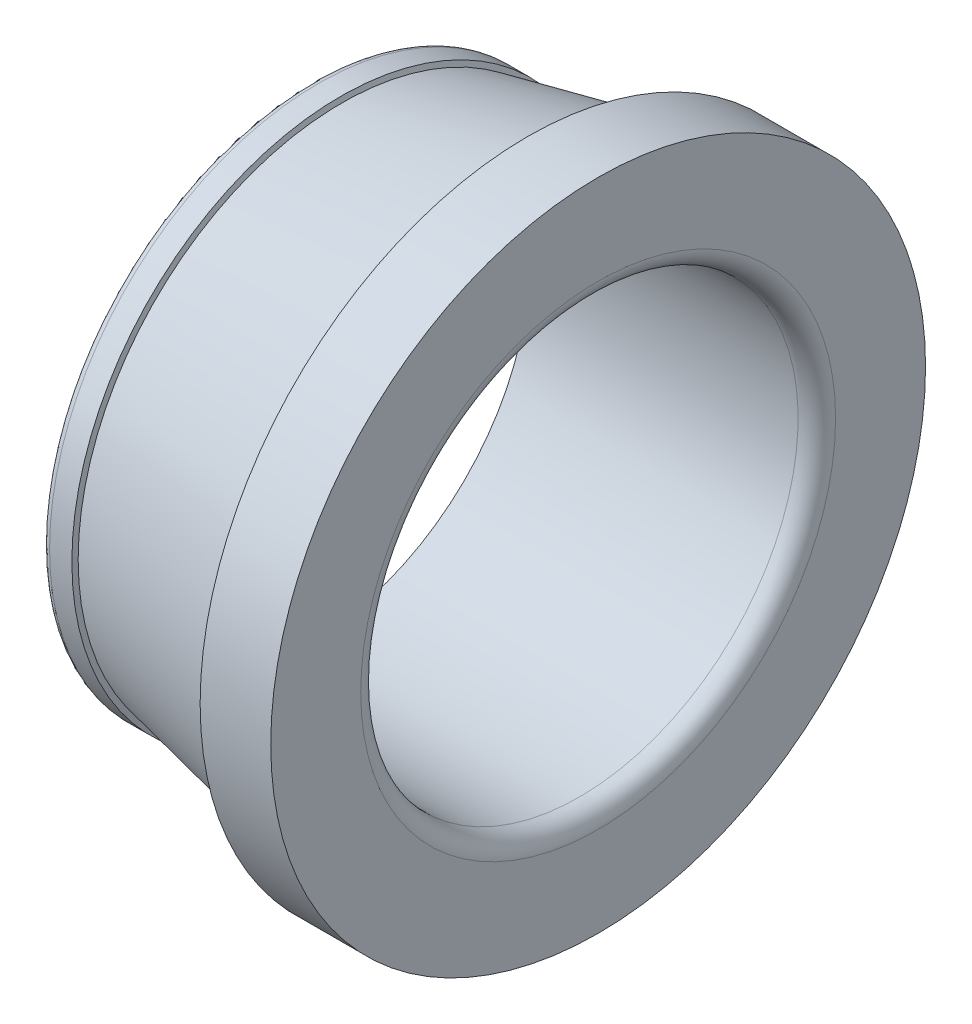
ISO-10303-21;
HEADER;
FILE_DESCRIPTION(('STEP AP214'),'2;1');
FILE_NAME('part.step','',(''),(''),'','','');
FILE_SCHEMA(('AUTOMOTIVE_DESIGN { 1 0 10303 214 1 1 1 1 }'));
ENDSEC;
DATA;
#1=APPLICATION_CONTEXT('core data for automotive mechanical design processes');
#2=APPLICATION_PROTOCOL_DEFINITION('international standard','automotive_design',2000,#1);
#3=PRODUCT_CONTEXT('',#1,'mechanical');
#4=PRODUCT('Part','Part','',(#3));
#5=PRODUCT_RELATED_PRODUCT_CATEGORY('part','',(#4));
#6=PRODUCT_DEFINITION_FORMATION('','',#4);
#7=PRODUCT_DEFINITION_CONTEXT('part definition',#1,'design');
#8=PRODUCT_DEFINITION('design','',#6,#7);
#9=PRODUCT_DEFINITION_SHAPE('','',#8);
#10=(LENGTH_UNIT() NAMED_UNIT(*) SI_UNIT(.MILLI.,.METRE.));
#11=(NAMED_UNIT(*) PLANE_ANGLE_UNIT() SI_UNIT($,.RADIAN.));
#12=(NAMED_UNIT(*) SI_UNIT($,.STERADIAN.) SOLID_ANGLE_UNIT());
#13=UNCERTAINTY_MEASURE_WITH_UNIT(LENGTH_MEASURE(1.E-05),#10,'distance_accuracy_value','');
#14=(GEOMETRIC_REPRESENTATION_CONTEXT(3) GLOBAL_UNCERTAINTY_ASSIGNED_CONTEXT((#13)) GLOBAL_UNIT_ASSIGNED_CONTEXT((#10,
#11,#12)) REPRESENTATION_CONTEXT('',''));
#15=CARTESIAN_POINT('',(0.,0.,0.));
#16=DIRECTION('',(0.,0.,1.));
#17=DIRECTION('',(1.,0.,0.));
#18=AXIS2_PLACEMENT_3D('',#15,#16,#17);
#19=CARTESIAN_POINT('',(1.25,20.9,0.));
#20=DIRECTION('',(1.,0.,0.));
#21=DIRECTION('',(0.,0.,-1.));
#22=AXIS2_PLACEMENT_3D('',#19,#20,#21);
#23=PLANE('',#22);
#24=CARTESIAN_POINT('',(1.25,0.,0.));
#25=DIRECTION('',(-1.,0.,0.));
#26=DIRECTION('',(0.,0.,1.));
#27=AXIS2_PLACEMENT_3D('',#24,#25,#26);
#28=CIRCLE('',#27,17.5);
#29=CARTESIAN_POINT('',(1.25,0.,17.5));
#30=VERTEX_POINT('',#29);
#31=EDGE_CURVE('E10',#30,#30,#28,.T.);
#32=ORIENTED_EDGE('',*,*,#31,.F.);
#33=EDGE_LOOP('',(#32));
#34=FACE_BOUND('',#33,.T.);
#35=CARTESIAN_POINT('',(1.25,0.,0.));
#36=DIRECTION('',(-1.,0.,0.));
#37=DIRECTION('',(0.,0.,1.));
#38=AXIS2_PLACEMENT_3D('',#35,#36,#37);
#39=CIRCLE('',#38,20.9);
#40=CARTESIAN_POINT('',(1.25,0.,20.9));
#41=VERTEX_POINT('',#40);
#42=EDGE_CURVE('E49',#41,#41,#39,.T.);
#43=ORIENTED_EDGE('',*,*,#42,.T.);
#44=EDGE_LOOP('',(#43));
#45=FACE_BOUND('',#44,.T.);
#46=ADVANCED_FACE('F15',(#34,#45),#23,.F.);
#47=CARTESIAN_POINT('',(0.,0.,0.));
#48=DIRECTION('',(-1.,0.,0.));
#49=DIRECTION('',(0.,0.,1.));
#50=AXIS2_PLACEMENT_3D('',#47,#48,#49);
#51=CYLINDRICAL_SURFACE('',#50,17.5);
#52=CARTESIAN_POINT('',(22.75,0.,0.));
#53=DIRECTION('',(-1.,0.,0.));
#54=DIRECTION('',(0.,0.,1.));
#55=AXIS2_PLACEMENT_3D('',#52,#53,#54);
#56=CIRCLE('',#55,17.5);
#57=CARTESIAN_POINT('',(22.75,0.,17.5));
#58=VERTEX_POINT('',#57);
#59=EDGE_CURVE('E21',#58,#58,#56,.T.);
#60=ORIENTED_EDGE('',*,*,#59,.F.);
#61=EDGE_LOOP('',(#60));
#62=FACE_BOUND('',#61,.T.);
#63=ORIENTED_EDGE('',*,*,#31,.T.);
#64=EDGE_LOOP('',(#63));
#65=FACE_BOUND('',#64,.T.);
#66=ADVANCED_FACE('F73',(#62,#65),#51,.F.);
#67=CARTESIAN_POINT('',(22.75,0.,0.));
#68=DIRECTION('',(-1.,0.,0.));
#69=DIRECTION('',(0.,0.,1.));
#70=AXIS2_PLACEMENT_3D('',#67,#68,#69);
#71=TOROIDAL_SURFACE('',#70,19.,1.5);
#72=CARTESIAN_POINT('',(24.25,0.,0.));
#73=DIRECTION('',(-1.,0.,0.));
#74=DIRECTION('',(0.,0.,1.));
#75=AXIS2_PLACEMENT_3D('',#72,#73,#74);
#76=CIRCLE('',#75,19.);
#77=CARTESIAN_POINT('',(24.25,0.,19.));
#78=VERTEX_POINT('',#77);
#79=EDGE_CURVE('E25',#78,#78,#76,.T.);
#80=ORIENTED_EDGE('',*,*,#79,.F.);
#81=EDGE_LOOP('',(#80));
#82=FACE_BOUND('',#81,.T.);
#83=ORIENTED_EDGE('',*,*,#59,.T.);
#84=EDGE_LOOP('',(#83));
#85=FACE_BOUND('',#84,.T.);
#86=ADVANCED_FACE('F78',(#82,#85),#71,.T.);
#87=CARTESIAN_POINT('',(24.25,19.,0.));
#88=DIRECTION('',(-1.,0.,0.));
#89=DIRECTION('',(0.,0.,1.));
#90=AXIS2_PLACEMENT_3D('',#87,#88,#89);
#91=PLANE('',#90);
#92=CARTESIAN_POINT('',(24.25,0.,0.));
#93=DIRECTION('',(-1.,0.,0.));
#94=DIRECTION('',(0.,0.,1.));
#95=AXIS2_PLACEMENT_3D('',#92,#93,#94);
#96=CIRCLE('',#95,26.2);
#97=CARTESIAN_POINT('',(24.25,0.,26.2));
#98=VERTEX_POINT('',#97);
#99=EDGE_CURVE('E29',#98,#98,#96,.T.);
#100=ORIENTED_EDGE('',*,*,#99,.F.);
#101=EDGE_LOOP('',(#100));
#102=FACE_BOUND('',#101,.T.);
#103=ORIENTED_EDGE('',*,*,#79,.T.);
#104=EDGE_LOOP('',(#103));
#105=FACE_BOUND('',#104,.T.);
#106=ADVANCED_FACE('F83',(#102,#105),#91,.F.);
#107=CARTESIAN_POINT('',(0.,0.,0.));
#108=DIRECTION('',(-1.,0.,0.));
#109=DIRECTION('',(0.,0.,1.));
#110=AXIS2_PLACEMENT_3D('',#107,#108,#109);
#111=CYLINDRICAL_SURFACE('',#110,26.2);
#112=CARTESIAN_POINT('',(18.5997511111111,0.,0.));
#113=DIRECTION('',(-1.,0.,0.));
#114=DIRECTION('',(0.,0.,1.));
#115=AXIS2_PLACEMENT_3D('',#112,#113,#114);
#116=CIRCLE('',#115,26.2);
#117=CARTESIAN_POINT('',(18.5997511111111,0.,26.2));
#118=VERTEX_POINT('',#117);
#119=EDGE_CURVE('E34',#118,#118,#116,.T.);
#120=ORIENTED_EDGE('',*,*,#119,.F.);
#121=EDGE_LOOP('',(#120));
#122=FACE_BOUND('',#121,.T.);
#123=ORIENTED_EDGE('',*,*,#99,.T.);
#124=EDGE_LOOP('',(#123));
#125=FACE_BOUND('',#124,.T.);
#126=ADVANCED_FACE('F89',(#122,#125),#111,.T.);
#127=CARTESIAN_POINT('',(18.5997511111111,0.,0.));
#128=DIRECTION('',(-1.,0.,0.));
#129=DIRECTION('',(0.,0.,1.));
#130=AXIS2_PLACEMENT_3D('',#127,#128,#129);
#131=CONICAL_SURFACE('',#130,26.2,1.3289573707766);
#132=CARTESIAN_POINT('',(19.0649954792768,0.,0.));
#133=DIRECTION('',(-1.,0.,0.));
#134=DIRECTION('',(0.,0.,1.));
#135=AXIS2_PLACEMENT_3D('',#132,#133,#134);
#136=CIRCLE('',#135,24.3138741831118);
#137=CARTESIAN_POINT('',(19.0649954792768,0.,24.3138741831118));
#138=VERTEX_POINT('',#137);
#139=EDGE_CURVE('E37',#138,#138,#136,.T.);
#140=ORIENTED_EDGE('',*,*,#139,.F.);
#141=EDGE_LOOP('',(#140));
#142=FACE_BOUND('',#141,.T.);
#143=ORIENTED_EDGE('',*,*,#119,.T.);
#144=EDGE_LOOP('',(#143));
#145=FACE_BOUND('',#144,.T.);
#146=ADVANCED_FACE('F93',(#142,#145),#131,.F.);
#147=CARTESIAN_POINT('',(19.0649954792768,0.,0.));
#148=DIRECTION('',(1.,0.,0.));
#149=DIRECTION('',(0.,0.,-1.));
#150=AXIS2_PLACEMENT_3D('',#147,#148,#149);
#151=CONICAL_SURFACE('',#150,24.3138741831118,0.206932370978414);
#152=CARTESIAN_POINT('',(3.73406587419581,0.,0.));
#153=DIRECTION('',(-1.,0.,0.));
#154=DIRECTION('',(0.,0.,1.));
#155=AXIS2_PLACEMENT_3D('',#152,#153,#154);
#156=CIRCLE('',#155,21.095336546053);
#157=CARTESIAN_POINT('',(3.73406587419581,0.,21.095336546053));
#158=VERTEX_POINT('',#157);
#159=EDGE_CURVE('E40',#158,#158,#156,.T.);
#160=ORIENTED_EDGE('',*,*,#159,.F.);
#161=EDGE_LOOP('',(#160));
#162=FACE_BOUND('',#161,.T.);
#163=ORIENTED_EDGE('',*,*,#139,.T.);
#164=EDGE_LOOP('',(#163));
#165=FACE_BOUND('',#164,.T.);
#166=ADVANCED_FACE('F69',(#162,#165),#151,.T.);
#167=CARTESIAN_POINT('',(3.73406587419581,0.,0.));
#168=DIRECTION('',(-1.,0.,0.));
#169=DIRECTION('',(0.,0.,1.));
#170=AXIS2_PLACEMENT_3D('',#167,#168,#169);
#171=CONICAL_SURFACE('',#170,21.095336546053,1.32895737077659);
#172=CARTESIAN_POINT('',(3.63424888888889,0.,0.));
#173=DIRECTION('',(-1.,0.,0.));
#174=DIRECTION('',(0.,0.,1.));
#175=AXIS2_PLACEMENT_3D('',#172,#173,#174);
#176=CIRCLE('',#175,21.5);
#177=CARTESIAN_POINT('',(3.63424888888889,0.,21.5));
#178=VERTEX_POINT('',#177);
#179=EDGE_CURVE('E43',#178,#178,#176,.T.);
#180=ORIENTED_EDGE('',*,*,#179,.F.);
#181=EDGE_LOOP('',(#180));
#182=FACE_BOUND('',#181,.T.);
#183=ORIENTED_EDGE('',*,*,#159,.T.);
#184=EDGE_LOOP('',(#183));
#185=FACE_BOUND('',#184,.T.);
#186=ADVANCED_FACE('F62',(#182,#185),#171,.T.);
#187=CARTESIAN_POINT('',(0.,0.,0.));
#188=DIRECTION('',(-1.,0.,0.));
#189=DIRECTION('',(0.,0.,1.));
#190=AXIS2_PLACEMENT_3D('',#187,#188,#189);
#191=CYLINDRICAL_SURFACE('',#190,21.5);
#192=ORIENTED_EDGE('',*,*,#179,.T.);
#193=EDGE_LOOP('',(#192));
#194=FACE_BOUND('',#193,.T.);
#195=CARTESIAN_POINT('',(1.85,0.,0.));
#196=DIRECTION('',(-1.,0.,0.));
#197=DIRECTION('',(0.,0.,1.));
#198=AXIS2_PLACEMENT_3D('',#195,#196,#197);
#199=CIRCLE('',#198,21.5);
#200=CARTESIAN_POINT('',(1.85,0.,21.5));
#201=VERTEX_POINT('',#200);
#202=EDGE_CURVE('E46',#201,#201,#199,.T.);
#203=ORIENTED_EDGE('',*,*,#202,.F.);
#204=EDGE_LOOP('',(#203));
#205=FACE_BOUND('',#204,.T.);
#206=ADVANCED_FACE('F57',(#194,#205),#191,.T.);
#207=CARTESIAN_POINT('',(1.85,0.,0.));
#208=DIRECTION('',(-1.,0.,0.));
#209=DIRECTION('',(0.,0.,1.));
#210=AXIS2_PLACEMENT_3D('',#207,#208,#209);
#211=TOROIDAL_SURFACE('',#210,20.9,0.6);
#212=ORIENTED_EDGE('',*,*,#42,.F.);
#213=EDGE_LOOP('',(#212));
#214=FACE_BOUND('',#213,.T.);
#215=ORIENTED_EDGE('',*,*,#202,.T.);
#216=EDGE_LOOP('',(#215));
#217=FACE_BOUND('',#216,.T.);
#218=ADVANCED_FACE('F54',(#214,#217),#211,.T.);
#219=CLOSED_SHELL('',(#46,#66,#86,#106,#126,#146,#166,#186,#206,#218));
#220=MANIFOLD_SOLID_BREP('B1',#219);
#221=ADVANCED_BREP_SHAPE_REPRESENTATION('',(#18,#220),#14);
#222=SHAPE_DEFINITION_REPRESENTATION(#9,#221);
ENDSEC;
END-ISO-10303-21;
